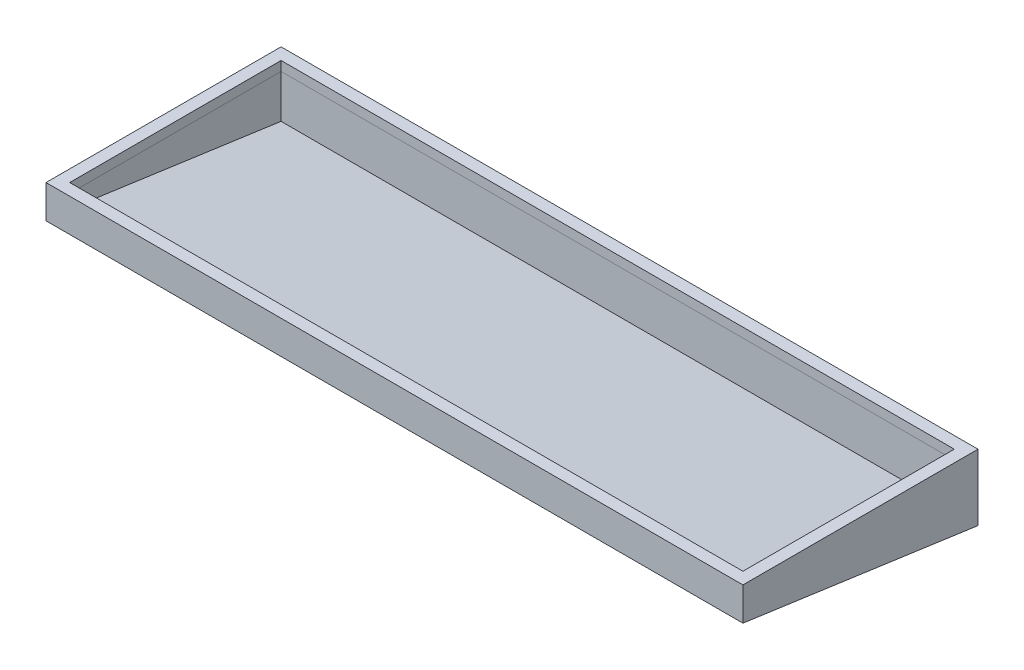
ISO-10303-21;
HEADER;
FILE_DESCRIPTION(('STEP AP214'),'2;1');
FILE_NAME('part.step','',(''),(''),'','','');
FILE_SCHEMA(('AUTOMOTIVE_DESIGN { 1 0 10303 214 1 1 1 1 }'));
ENDSEC;
DATA;
#1=APPLICATION_CONTEXT('core data for automotive mechanical design processes');
#2=APPLICATION_PROTOCOL_DEFINITION('international standard','automotive_design',2000,#1);
#3=PRODUCT_CONTEXT('',#1,'mechanical');
#4=PRODUCT('Part','Part','',(#3));
#5=PRODUCT_RELATED_PRODUCT_CATEGORY('part','',(#4));
#6=PRODUCT_DEFINITION_FORMATION('','',#4);
#7=PRODUCT_DEFINITION_CONTEXT('part definition',#1,'design');
#8=PRODUCT_DEFINITION('design','',#6,#7);
#9=PRODUCT_DEFINITION_SHAPE('','',#8);
#10=(LENGTH_UNIT() NAMED_UNIT(*) SI_UNIT(.MILLI.,.METRE.));
#11=(NAMED_UNIT(*) PLANE_ANGLE_UNIT() SI_UNIT($,.RADIAN.));
#12=(NAMED_UNIT(*) SI_UNIT($,.STERADIAN.) SOLID_ANGLE_UNIT());
#13=UNCERTAINTY_MEASURE_WITH_UNIT(LENGTH_MEASURE(1.E-05),#10,'distance_accuracy_value','');
#14=(GEOMETRIC_REPRESENTATION_CONTEXT(3) GLOBAL_UNCERTAINTY_ASSIGNED_CONTEXT((#13)) GLOBAL_UNIT_ASSIGNED_CONTEXT((#10,
#11,#12)) REPRESENTATION_CONTEXT('',''));
#15=CARTESIAN_POINT('',(0.,0.,0.));
#16=DIRECTION('',(0.,0.,1.));
#17=DIRECTION('',(1.,0.,0.));
#18=AXIS2_PLACEMENT_3D('',#15,#16,#17);
#19=CARTESIAN_POINT('',(0.,5.08,0.));
#20=DIRECTION('',(0.,-1.,0.));
#21=DIRECTION('',(0.,0.,-1.));
#22=AXIS2_PLACEMENT_3D('',#19,#20,#21);
#23=PLANE('',#22);
#24=DIRECTION('',(0.,0.,1.));
#25=VECTOR('',#24,1.);
#26=CARTESIAN_POINT('',(-6.35,5.08,6.35));
#27=LINE('',#26,#25);
#28=CARTESIAN_POINT('',(-6.35,5.08,-119.699999868));
#29=VERTEX_POINT('',#28);
#30=CARTESIAN_POINT('',(-6.35,5.08,6.35));
#31=VERTEX_POINT('',#30);
#32=EDGE_CURVE('E203',#29,#31,#27,.T.);
#33=ORIENTED_EDGE('',*,*,#32,.T.);
#34=DIRECTION('',(1.,0.,0.));
#35=VECTOR('',#34,1.);
#36=CARTESIAN_POINT('',(-6.35,5.08,6.35));
#37=LINE('',#36,#35);
#38=CARTESIAN_POINT('',(367.349999868,5.08,6.35));
#39=VERTEX_POINT('',#38);
#40=EDGE_CURVE('E205',#31,#39,#37,.T.);
#41=ORIENTED_EDGE('',*,*,#40,.T.);
#42=DIRECTION('',(0.,0.,-1.));
#43=VECTOR('',#42,1.);
#44=CARTESIAN_POINT('',(367.349999868,5.08,6.35));
#45=LINE('',#44,#43);
#46=CARTESIAN_POINT('',(367.349999868,5.08,-119.699999868));
#47=VERTEX_POINT('',#46);
#48=EDGE_CURVE('E207',#39,#47,#45,.T.);
#49=ORIENTED_EDGE('',*,*,#48,.T.);
#50=DIRECTION('',(-1.,0.,0.));
#51=VECTOR('',#50,1.);
#52=CARTESIAN_POINT('',(-6.35,5.08,-119.699999868));
#53=LINE('',#52,#51);
#54=EDGE_CURVE('E56',#47,#29,#53,.T.);
#55=ORIENTED_EDGE('',*,*,#54,.T.);
#56=EDGE_LOOP('',(#33,#41,#49,#55));
#57=FACE_BOUND('',#56,.T.);
#58=DIRECTION('',(0.,0.,1.));
#59=VECTOR('',#58,1.);
#60=CARTESIAN_POINT('',(0.,5.08,0.));
#61=LINE('',#60,#59);
#62=CARTESIAN_POINT('',(0.,5.08,-113.349999868));
#63=VERTEX_POINT('',#62);
#64=CARTESIAN_POINT('',(0.,5.08,0.));
#65=VERTEX_POINT('',#64);
#66=EDGE_CURVE('E178',#63,#65,#61,.T.);
#67=ORIENTED_EDGE('',*,*,#66,.F.);
#68=DIRECTION('',(-1.,0.,0.));
#69=VECTOR('',#68,1.);
#70=CARTESIAN_POINT('',(0.,5.08,-113.349999868));
#71=LINE('',#70,#69);
#72=CARTESIAN_POINT('',(360.999999868,5.08,-113.349999868));
#73=VERTEX_POINT('',#72);
#74=EDGE_CURVE('E185',#73,#63,#71,.T.);
#75=ORIENTED_EDGE('',*,*,#74,.F.);
#76=DIRECTION('',(0.,0.,-1.));
#77=VECTOR('',#76,1.);
#78=CARTESIAN_POINT('',(360.999999868,5.08,0.));
#79=LINE('',#78,#77);
#80=CARTESIAN_POINT('',(360.999999868,5.08,0.));
#81=VERTEX_POINT('',#80);
#82=EDGE_CURVE('E183',#81,#73,#79,.T.);
#83=ORIENTED_EDGE('',*,*,#82,.F.);
#84=DIRECTION('',(1.,0.,0.));
#85=VECTOR('',#84,1.);
#86=CARTESIAN_POINT('',(0.,5.08,0.));
#87=LINE('',#86,#85);
#88=EDGE_CURVE('E180',#65,#81,#87,.T.);
#89=ORIENTED_EDGE('',*,*,#88,.F.);
#90=EDGE_LOOP('',(#67,#75,#83,#89));
#91=FACE_BOUND('',#90,.T.);
#92=ADVANCED_FACE('F33',(#57,#91),#23,.F.);
#93=CARTESIAN_POINT('',(-6.35,5.08,6.35));
#94=DIRECTION('',(1.,0.,0.));
#95=DIRECTION('',(0.,0.,-1.));
#96=AXIS2_PLACEMENT_3D('',#93,#94,#95);
#97=PLANE('',#96);
#98=DIRECTION('',(0.,-1.,0.));
#99=VECTOR('',#98,1.);
#100=CARTESIAN_POINT('',(-6.35,5.08,-119.699999868));
#101=LINE('',#100,#99);
#102=CARTESIAN_POINT('',(-6.35000000000001,-30.4151721956851,-119.699999868));
#103=VERTEX_POINT('',#102);
#104=EDGE_CURVE('E210',#29,#103,#101,.T.);
#105=ORIENTED_EDGE('',*,*,#104,.T.);
#106=DIRECTION('',(0.,-0.139173100960066,-0.99026806874157));
#107=VECTOR('',#106,1.);
#108=CARTESIAN_POINT('',(-6.35000000000001,-30.4151721956851,-119.699999868));
#109=LINE('',#108,#107);
#110=CARTESIAN_POINT('',(-6.35000000000001,-12.7,6.35));
#111=VERTEX_POINT('',#110);
#112=EDGE_CURVE('E159',#111,#103,#109,.T.);
#113=ORIENTED_EDGE('',*,*,#112,.F.);
#114=DIRECTION('',(0.,-1.,0.));
#115=VECTOR('',#114,1.);
#116=CARTESIAN_POINT('',(-6.35,5.08,6.35));
#117=LINE('',#116,#115);
#118=EDGE_CURVE('E11',#31,#111,#117,.T.);
#119=ORIENTED_EDGE('',*,*,#118,.F.);
#120=ORIENTED_EDGE('',*,*,#32,.F.);
#121=EDGE_LOOP('',(#105,#113,#119,#120));
#122=FACE_BOUND('',#121,.T.);
#123=ADVANCED_FACE('F35',(#122),#97,.F.);
#124=CARTESIAN_POINT('',(-6.35,5.08,6.35));
#125=DIRECTION('',(0.,0.,-1.));
#126=DIRECTION('',(-1.,0.,0.));
#127=AXIS2_PLACEMENT_3D('',#124,#125,#126);
#128=PLANE('',#127);
#129=ORIENTED_EDGE('',*,*,#118,.T.);
#130=DIRECTION('',(-1.,0.,0.));
#131=VECTOR('',#130,1.);
#132=CARTESIAN_POINT('',(-6.35000000000001,-12.7,6.35));
#133=LINE('',#132,#131);
#134=CARTESIAN_POINT('',(367.349999868,-12.7,6.35));
#135=VERTEX_POINT('',#134);
#136=EDGE_CURVE('E174',#135,#111,#133,.T.);
#137=ORIENTED_EDGE('',*,*,#136,.F.);
#138=DIRECTION('',(0.,-1.,0.));
#139=VECTOR('',#138,1.);
#140=CARTESIAN_POINT('',(367.349999868,5.08,6.35));
#141=LINE('',#140,#139);
#142=EDGE_CURVE('E41',#39,#135,#141,.T.);
#143=ORIENTED_EDGE('',*,*,#142,.F.);
#144=ORIENTED_EDGE('',*,*,#40,.F.);
#145=EDGE_LOOP('',(#129,#137,#143,#144));
#146=FACE_BOUND('',#145,.T.);
#147=ADVANCED_FACE('F224',(#146),#128,.F.);
#148=CARTESIAN_POINT('',(367.349999868,5.08,6.35));
#149=DIRECTION('',(-1.,0.,0.));
#150=DIRECTION('',(0.,0.,1.));
#151=AXIS2_PLACEMENT_3D('',#148,#149,#150);
#152=PLANE('',#151);
#153=ORIENTED_EDGE('',*,*,#142,.T.);
#154=DIRECTION('',(0.,0.139173100960066,0.99026806874157));
#155=VECTOR('',#154,1.);
#156=CARTESIAN_POINT('',(367.349999868,-12.7,6.35));
#157=LINE('',#156,#155);
#158=CARTESIAN_POINT('',(367.349999868,-30.4151721956851,-119.699999868));
#159=VERTEX_POINT('',#158);
#160=EDGE_CURVE('E171',#159,#135,#157,.T.);
#161=ORIENTED_EDGE('',*,*,#160,.F.);
#162=DIRECTION('',(0.,-1.,0.));
#163=VECTOR('',#162,1.);
#164=CARTESIAN_POINT('',(367.349999868,5.08,-119.699999868));
#165=LINE('',#164,#163);
#166=EDGE_CURVE('E212',#47,#159,#165,.T.);
#167=ORIENTED_EDGE('',*,*,#166,.F.);
#168=ORIENTED_EDGE('',*,*,#48,.F.);
#169=EDGE_LOOP('',(#153,#161,#167,#168));
#170=FACE_BOUND('',#169,.T.);
#171=ADVANCED_FACE('F217',(#170),#152,.F.);
#172=CARTESIAN_POINT('',(-6.35,5.08,-119.699999868));
#173=DIRECTION('',(0.,0.,1.));
#174=DIRECTION('',(1.,0.,0.));
#175=AXIS2_PLACEMENT_3D('',#172,#173,#174);
#176=PLANE('',#175);
#177=ORIENTED_EDGE('',*,*,#166,.T.);
#178=DIRECTION('',(1.,0.,0.));
#179=VECTOR('',#178,1.);
#180=CARTESIAN_POINT('',(367.349999868,-30.4151721956851,-119.699999868));
#181=LINE('',#180,#179);
#182=EDGE_CURVE('E168',#103,#159,#181,.T.);
#183=ORIENTED_EDGE('',*,*,#182,.F.);
#184=ORIENTED_EDGE('',*,*,#104,.F.);
#185=ORIENTED_EDGE('',*,*,#54,.F.);
#186=EDGE_LOOP('',(#177,#183,#184,#185));
#187=FACE_BOUND('',#186,.T.);
#188=ADVANCED_FACE('F230',(#187),#176,.F.);
#189=CARTESIAN_POINT('',(0.,5.08,0.));
#190=DIRECTION('',(1.,0.,0.));
#191=DIRECTION('',(0.,0.,-1.));
#192=AXIS2_PLACEMENT_3D('',#189,#190,#191);
#193=PLANE('',#192);
#194=DIRECTION('',(0.,0.,1.));
#195=VECTOR('',#194,1.);
#196=CARTESIAN_POINT('',(0.,0.,0.));
#197=LINE('',#196,#195);
#198=CARTESIAN_POINT('',(0.,0.,-113.349999868));
#199=VERTEX_POINT('',#198);
#200=CARTESIAN_POINT('',(0.,0.,0.));
#201=VERTEX_POINT('',#200);
#202=EDGE_CURVE('E177',#199,#201,#197,.T.);
#203=ORIENTED_EDGE('',*,*,#202,.F.);
#204=DIRECTION('',(0.,-1.,0.));
#205=VECTOR('',#204,1.);
#206=CARTESIAN_POINT('',(0.,5.08,-113.349999868));
#207=LINE('',#206,#205);
#208=EDGE_CURVE('E187',#63,#199,#207,.T.);
#209=ORIENTED_EDGE('',*,*,#208,.F.);
#210=ORIENTED_EDGE('',*,*,#66,.T.);
#211=DIRECTION('',(0.,-1.,0.));
#212=VECTOR('',#211,1.);
#213=CARTESIAN_POINT('',(0.,5.08,0.));
#214=LINE('',#213,#212);
#215=EDGE_CURVE('E200',#65,#201,#214,.T.);
#216=ORIENTED_EDGE('',*,*,#215,.T.);
#217=EDGE_LOOP('',(#203,#209,#210,#216));
#218=FACE_BOUND('',#217,.T.);
#219=ADVANCED_FACE('F232',(#218),#193,.T.);
#220=CARTESIAN_POINT('',(0.,5.08,0.));
#221=DIRECTION('',(0.,0.,-1.));
#222=DIRECTION('',(-1.,0.,0.));
#223=AXIS2_PLACEMENT_3D('',#220,#221,#222);
#224=PLANE('',#223);
#225=DIRECTION('',(1.,0.,0.));
#226=VECTOR('',#225,1.);
#227=CARTESIAN_POINT('',(0.,0.,0.));
#228=LINE('',#227,#226);
#229=CARTESIAN_POINT('',(360.999999868,0.,0.));
#230=VERTEX_POINT('',#229);
#231=EDGE_CURVE('E189',#201,#230,#228,.T.);
#232=ORIENTED_EDGE('',*,*,#231,.F.);
#233=ORIENTED_EDGE('',*,*,#215,.F.);
#234=ORIENTED_EDGE('',*,*,#88,.T.);
#235=DIRECTION('',(0.,-1.,0.));
#236=VECTOR('',#235,1.);
#237=CARTESIAN_POINT('',(360.999999868,5.08,0.));
#238=LINE('',#237,#236);
#239=EDGE_CURVE('E197',#81,#230,#238,.T.);
#240=ORIENTED_EDGE('',*,*,#239,.T.);
#241=EDGE_LOOP('',(#232,#233,#234,#240));
#242=FACE_BOUND('',#241,.T.);
#243=ADVANCED_FACE('F238',(#242),#224,.T.);
#244=CARTESIAN_POINT('',(360.999999868,5.08,0.));
#245=DIRECTION('',(-1.,0.,0.));
#246=DIRECTION('',(0.,0.,1.));
#247=AXIS2_PLACEMENT_3D('',#244,#245,#246);
#248=PLANE('',#247);
#249=DIRECTION('',(0.,0.,-1.));
#250=VECTOR('',#249,1.);
#251=CARTESIAN_POINT('',(360.999999868,0.,0.));
#252=LINE('',#251,#250);
#253=CARTESIAN_POINT('',(360.999999868,0.,-113.349999868));
#254=VERTEX_POINT('',#253);
#255=EDGE_CURVE('E191',#230,#254,#252,.T.);
#256=ORIENTED_EDGE('',*,*,#255,.F.);
#257=ORIENTED_EDGE('',*,*,#239,.F.);
#258=ORIENTED_EDGE('',*,*,#82,.T.);
#259=DIRECTION('',(0.,-1.,0.));
#260=VECTOR('',#259,1.);
#261=CARTESIAN_POINT('',(360.999999868,5.08,-113.349999868));
#262=LINE('',#261,#260);
#263=EDGE_CURVE('E48',#73,#254,#262,.T.);
#264=ORIENTED_EDGE('',*,*,#263,.T.);
#265=EDGE_LOOP('',(#256,#257,#258,#264));
#266=FACE_BOUND('',#265,.T.);
#267=ADVANCED_FACE('F251',(#266),#248,.T.);
#268=CARTESIAN_POINT('',(0.,5.08,-113.349999868));
#269=DIRECTION('',(0.,0.,1.));
#270=DIRECTION('',(1.,0.,0.));
#271=AXIS2_PLACEMENT_3D('',#268,#269,#270);
#272=PLANE('',#271);
#273=DIRECTION('',(-1.,0.,0.));
#274=VECTOR('',#273,1.);
#275=CARTESIAN_POINT('',(0.,0.,-113.349999868));
#276=LINE('',#275,#274);
#277=EDGE_CURVE('E181',#254,#199,#276,.T.);
#278=ORIENTED_EDGE('',*,*,#277,.F.);
#279=ORIENTED_EDGE('',*,*,#263,.F.);
#280=ORIENTED_EDGE('',*,*,#74,.T.);
#281=ORIENTED_EDGE('',*,*,#208,.T.);
#282=EDGE_LOOP('',(#278,#279,#280,#281));
#283=FACE_BOUND('',#282,.T.);
#284=ADVANCED_FACE('F255',(#283),#272,.T.);
#285=CARTESIAN_POINT('',(0.,-13.3291603739273,1.87329132483379));
#286=DIRECTION('',(0.,0.99026806874157,-0.139173100960066));
#287=DIRECTION('',(0.,0.139173100960066,0.99026806874157));
#288=AXIS2_PLACEMENT_3D('',#285,#286,#287);
#289=PLANE('',#288);
#290=ORIENTED_EDGE('',*,*,#112,.T.);
#291=ORIENTED_EDGE('',*,*,#182,.T.);
#292=ORIENTED_EDGE('',*,*,#160,.T.);
#293=ORIENTED_EDGE('',*,*,#136,.T.);
#294=EDGE_LOOP('',(#290,#291,#292,#293));
#295=FACE_BOUND('',#294,.T.);
#296=ADVANCED_FACE('F222',(#295),#289,.F.);
#297=CARTESIAN_POINT('',(0.,0.,0.));
#298=DIRECTION('',(0.,-1.,0.));
#299=DIRECTION('',(0.,0.,-1.));
#300=AXIS2_PLACEMENT_3D('',#297,#298,#299);
#301=PLANE('',#300);
#302=DIRECTION('',(0.,0.,-1.));
#303=VECTOR('',#302,1.);
#304=CARTESIAN_POINT('',(-0.475000065999999,0.,6.35));
#305=LINE('',#304,#303);
#306=CARTESIAN_POINT('',(-0.475000065999999,0.,0.475000065999999));
#307=VERTEX_POINT('',#306);
#308=CARTESIAN_POINT('',(-0.475000065999999,0.,-113.824999934));
#309=VERTEX_POINT('',#308);
#310=EDGE_CURVE('E157',#307,#309,#305,.T.);
#311=ORIENTED_EDGE('',*,*,#310,.T.);
#312=DIRECTION('',(1.,0.,0.));
#313=VECTOR('',#312,1.);
#314=CARTESIAN_POINT('',(-6.35,0.,-113.824999934));
#315=LINE('',#314,#313);
#316=CARTESIAN_POINT('',(361.474999934,0.,-113.824999934));
#317=VERTEX_POINT('',#316);
#318=EDGE_CURVE('E128',#309,#317,#315,.T.);
#319=ORIENTED_EDGE('',*,*,#318,.T.);
#320=DIRECTION('',(0.,0.,1.));
#321=VECTOR('',#320,1.);
#322=CARTESIAN_POINT('',(361.474999934,0.,6.35));
#323=LINE('',#322,#321);
#324=CARTESIAN_POINT('',(361.474999934,0.,0.475000065999999));
#325=VERTEX_POINT('',#324);
#326=EDGE_CURVE('E162',#317,#325,#323,.T.);
#327=ORIENTED_EDGE('',*,*,#326,.T.);
#328=DIRECTION('',(-1.,0.,0.));
#329=VECTOR('',#328,1.);
#330=CARTESIAN_POINT('',(-6.35,0.,0.475000065999999));
#331=LINE('',#330,#329);
#332=EDGE_CURVE('E151',#325,#307,#331,.T.);
#333=ORIENTED_EDGE('',*,*,#332,.T.);
#334=EDGE_LOOP('',(#311,#319,#327,#333));
#335=FACE_BOUND('',#334,.T.);
#336=ORIENTED_EDGE('',*,*,#255,.T.);
#337=ORIENTED_EDGE('',*,*,#277,.T.);
#338=ORIENTED_EDGE('',*,*,#202,.T.);
#339=ORIENTED_EDGE('',*,*,#231,.T.);
#340=EDGE_LOOP('',(#336,#337,#338,#339));
#341=FACE_BOUND('',#340,.T.);
#342=ADVANCED_FACE('F261',(#335,#341),#301,.T.);
#343=CARTESIAN_POINT('',(-0.475000065999999,5.08,6.35));
#344=DIRECTION('',(1.,0.,0.));
#345=DIRECTION('',(0.,0.,-1.));
#346=AXIS2_PLACEMENT_3D('',#343,#344,#345);
#347=PLANE('',#346);
#348=DIRECTION('',(0.,-1.,0.));
#349=VECTOR('',#348,1.);
#350=CARTESIAN_POINT('',(-0.475000065999999,5.08,-113.824999934));
#351=LINE('',#350,#349);
#352=CARTESIAN_POINT('',(-0.475000065999999,-23.656757879186,-113.824999934));
#353=VERTEX_POINT('',#352);
#354=EDGE_CURVE('E123',#309,#353,#351,.T.);
#355=ORIENTED_EDGE('',*,*,#354,.F.);
#356=ORIENTED_EDGE('',*,*,#310,.F.);
#357=DIRECTION('',(0.,-1.,0.));
#358=VECTOR('',#357,1.);
#359=CARTESIAN_POINT('',(-0.475000065999999,5.08,0.475000065999999));
#360=LINE('',#359,#358);
#361=CARTESIAN_POINT('',(-0.475000065999999,-7.59294047270259,0.475000065999999));
#362=VERTEX_POINT('',#361);
#363=EDGE_CURVE('E147',#307,#362,#360,.T.);
#364=ORIENTED_EDGE('',*,*,#363,.T.);
#365=DIRECTION('',(0.,-0.139173100960066,-0.99026806874157));
#366=VECTOR('',#365,1.);
#367=CARTESIAN_POINT('',(-0.475000065999999,-7.51133553542826,1.05564936587882));
#368=LINE('',#367,#366);
#369=EDGE_CURVE('E141',#362,#353,#368,.T.);
#370=ORIENTED_EDGE('',*,*,#369,.T.);
#371=EDGE_LOOP('',(#355,#356,#364,#370));
#372=FACE_BOUND('',#371,.T.);
#373=ADVANCED_FACE('F146',(#372),#347,.T.);
#374=CARTESIAN_POINT('',(-6.35,5.08,0.475000065999999));
#375=DIRECTION('',(0.,0.,-1.));
#376=DIRECTION('',(-1.,0.,0.));
#377=AXIS2_PLACEMENT_3D('',#374,#375,#376);
#378=PLANE('',#377);
#379=ORIENTED_EDGE('',*,*,#363,.F.);
#380=ORIENTED_EDGE('',*,*,#332,.F.);
#381=DIRECTION('',(0.,-1.,0.));
#382=VECTOR('',#381,1.);
#383=CARTESIAN_POINT('',(361.474999934,5.08,0.475000065999999));
#384=LINE('',#383,#382);
#385=CARTESIAN_POINT('',(361.474999934,-7.59294047270259,0.475000065999999));
#386=VERTEX_POINT('',#385);
#387=EDGE_CURVE('E152',#325,#386,#384,.T.);
#388=ORIENTED_EDGE('',*,*,#387,.T.);
#389=DIRECTION('',(-1.,0.,0.));
#390=VECTOR('',#389,1.);
#391=CARTESIAN_POINT('',(0.,-7.59294047270259,0.475000065999999));
#392=LINE('',#391,#390);
#393=EDGE_CURVE('E134',#386,#362,#392,.T.);
#394=ORIENTED_EDGE('',*,*,#393,.T.);
#395=EDGE_LOOP('',(#379,#380,#388,#394));
#396=FACE_BOUND('',#395,.T.);
#397=ADVANCED_FACE('F269',(#396),#378,.T.);
#398=CARTESIAN_POINT('',(361.474999934,5.08,6.35));
#399=DIRECTION('',(-1.,0.,0.));
#400=DIRECTION('',(0.,0.,1.));
#401=AXIS2_PLACEMENT_3D('',#398,#399,#400);
#402=PLANE('',#401);
#403=ORIENTED_EDGE('',*,*,#387,.F.);
#404=ORIENTED_EDGE('',*,*,#326,.F.);
#405=DIRECTION('',(0.,-1.,0.));
#406=VECTOR('',#405,1.);
#407=CARTESIAN_POINT('',(361.474999934,5.08,-113.824999934));
#408=LINE('',#407,#406);
#409=CARTESIAN_POINT('',(361.474999934,-23.656757879186,-113.824999934));
#410=VERTEX_POINT('',#409);
#411=EDGE_CURVE('E133',#317,#410,#408,.T.);
#412=ORIENTED_EDGE('',*,*,#411,.T.);
#413=DIRECTION('',(0.,0.139173100960066,0.99026806874157));
#414=VECTOR('',#413,1.);
#415=CARTESIAN_POINT('',(361.474999934,-7.51133553542826,1.05564936587882));
#416=LINE('',#415,#414);
#417=EDGE_CURVE('E144',#410,#386,#416,.T.);
#418=ORIENTED_EDGE('',*,*,#417,.T.);
#419=EDGE_LOOP('',(#403,#404,#412,#418));
#420=FACE_BOUND('',#419,.T.);
#421=ADVANCED_FACE('F266',(#420),#402,.T.);
#422=CARTESIAN_POINT('',(-6.35,5.08,-113.824999934));
#423=DIRECTION('',(0.,0.,1.));
#424=DIRECTION('',(1.,0.,0.));
#425=AXIS2_PLACEMENT_3D('',#422,#423,#424);
#426=PLANE('',#425);
#427=ORIENTED_EDGE('',*,*,#411,.F.);
#428=ORIENTED_EDGE('',*,*,#318,.F.);
#429=ORIENTED_EDGE('',*,*,#354,.T.);
#430=DIRECTION('',(1.,0.,0.));
#431=VECTOR('',#430,1.);
#432=CARTESIAN_POINT('',(0.,-23.656757879186,-113.824999934));
#433=LINE('',#432,#431);
#434=EDGE_CURVE('E126',#353,#410,#433,.T.);
#435=ORIENTED_EDGE('',*,*,#434,.T.);
#436=EDGE_LOOP('',(#427,#428,#429,#435));
#437=FACE_BOUND('',#436,.T.);
#438=ADVANCED_FACE('F125',(#437),#426,.T.);
#439=CARTESIAN_POINT('',(0.,-7.51133553542826,1.05564936587882));
#440=DIRECTION('',(0.,0.99026806874157,-0.139173100960066));
#441=DIRECTION('',(0.,0.139173100960066,0.99026806874157));
#442=AXIS2_PLACEMENT_3D('',#439,#440,#441);
#443=PLANE('',#442);
#444=ORIENTED_EDGE('',*,*,#369,.F.);
#445=ORIENTED_EDGE('',*,*,#393,.F.);
#446=ORIENTED_EDGE('',*,*,#417,.F.);
#447=ORIENTED_EDGE('',*,*,#434,.F.);
#448=EDGE_LOOP('',(#444,#445,#446,#447));
#449=FACE_BOUND('',#448,.T.);
#450=ADVANCED_FACE('F139',(#449),#443,.T.);
#451=CLOSED_SHELL('',(#92,#123,#147,#171,#188,#219,#243,#267,#284,#296,#342,#373,#397,#421,#438,#450));
#452=MANIFOLD_SOLID_BREP('B2',#451);
#453=ADVANCED_BREP_SHAPE_REPRESENTATION('',(#18,#452),#14);
#454=SHAPE_DEFINITION_REPRESENTATION(#9,#453);
ENDSEC;
END-ISO-10303-21;
